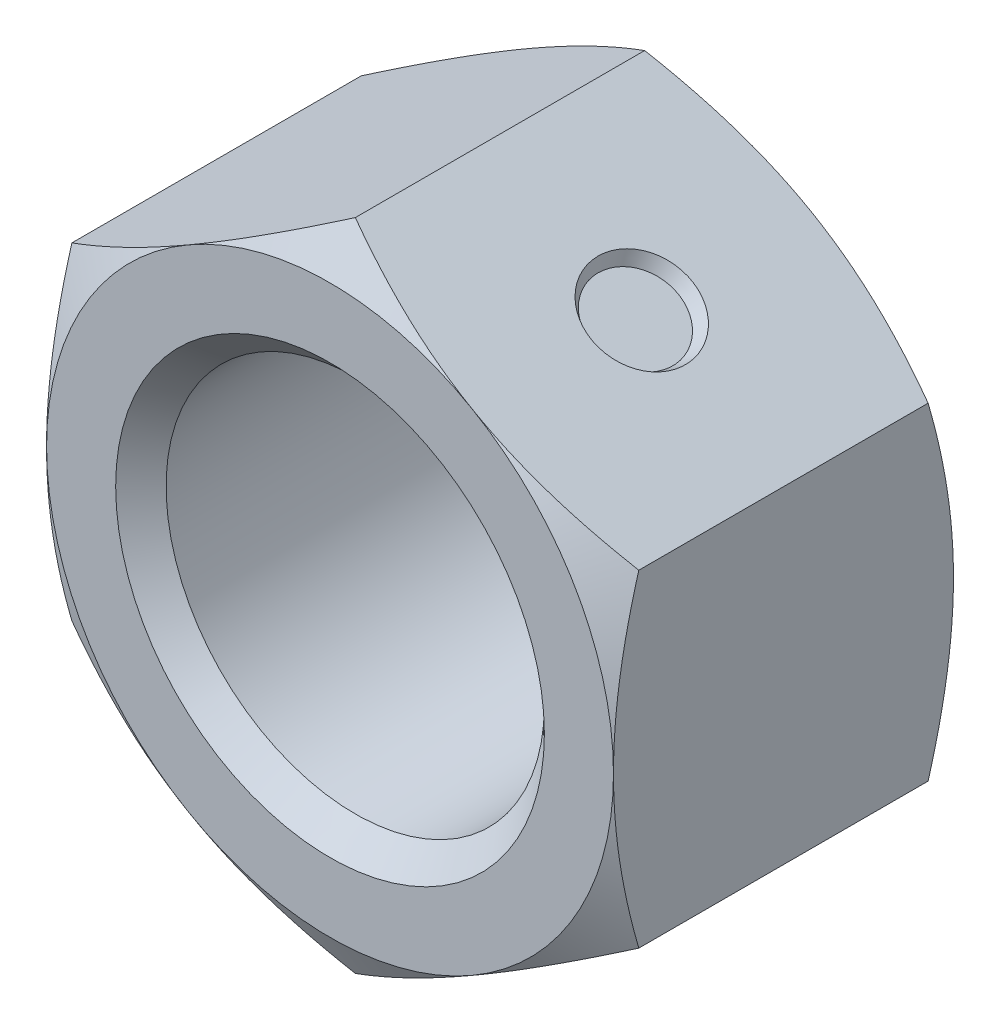
ISO-10303-21;
HEADER;
FILE_DESCRIPTION(('STEP AP214'),'2;1');
FILE_NAME('part.step','',(''),(''),'','','');
FILE_SCHEMA(('AUTOMOTIVE_DESIGN { 1 0 10303 214 1 1 1 1 }'));
ENDSEC;
DATA;
#1=APPLICATION_CONTEXT('core data for automotive mechanical design processes');
#2=APPLICATION_PROTOCOL_DEFINITION('international standard','automotive_design',2000,#1);
#3=PRODUCT_CONTEXT('',#1,'mechanical');
#4=PRODUCT('Part','Part','',(#3));
#5=PRODUCT_RELATED_PRODUCT_CATEGORY('part','',(#4));
#6=PRODUCT_DEFINITION_FORMATION('','',#4);
#7=PRODUCT_DEFINITION_CONTEXT('part definition',#1,'design');
#8=PRODUCT_DEFINITION('design','',#6,#7);
#9=PRODUCT_DEFINITION_SHAPE('','',#8);
#10=(LENGTH_UNIT() NAMED_UNIT(*) SI_UNIT(.MILLI.,.METRE.));
#11=(NAMED_UNIT(*) PLANE_ANGLE_UNIT() SI_UNIT($,.RADIAN.));
#12=(NAMED_UNIT(*) SI_UNIT($,.STERADIAN.) SOLID_ANGLE_UNIT());
#13=UNCERTAINTY_MEASURE_WITH_UNIT(LENGTH_MEASURE(1.E-05),#10,'distance_accuracy_value','');
#14=(GEOMETRIC_REPRESENTATION_CONTEXT(3) GLOBAL_UNCERTAINTY_ASSIGNED_CONTEXT((#13)) GLOBAL_UNIT_ASSIGNED_CONTEXT((#10,
#11,#12)) REPRESENTATION_CONTEXT('',''));
#15=CARTESIAN_POINT('',(0.,0.,0.));
#16=DIRECTION('',(0.,0.,1.));
#17=DIRECTION('',(1.,0.,0.));
#18=AXIS2_PLACEMENT_3D('',#15,#16,#17);
#19=CARTESIAN_POINT('',(32.87395,-11.6197933487305,27.2542));
#20=DIRECTION('',(0.499999999999994,0.866025403784442,0.));
#21=DIRECTION('',(0.,0.,-1.));
#22=AXIS2_PLACEMENT_3D('',#19,#20,#21);
#23=PLANE('',#22);
#24=CARTESIAN_POINT('',(32.87395,-11.6197933487305,27.2542));
#25=DIRECTION('',(0.499999999999994,0.866025403784442,0.));
#26=DIRECTION('',(-0.866025403784442,0.499999999999994,0.));
#27=AXIS2_PLACEMENT_3D('',#24,#25,#26);
#28=CIRCLE('',#27,1.08669128953229);
#29=CARTESIAN_POINT('',(31.9328477371938,-11.0764477039644,27.2542));
#30=VERTEX_POINT('',#29);
#31=EDGE_CURVE('E475',#30,#30,#28,.T.);
#32=ORIENTED_EDGE('',*,*,#31,.T.);
#33=EDGE_LOOP('',(#32));
#34=FACE_BOUND('',#33,.T.);
#35=ADVANCED_FACE('F49',(#34),#23,.T.);
#36=CARTESIAN_POINT('',(22.6441,-17.526,27.2542));
#37=DIRECTION('',(-1.,0.,0.));
#38=DIRECTION('',(0.,1.,0.));
#39=AXIS2_PLACEMENT_3D('',#36,#37,#38);
#40=PLANE('',#39);
#41=CARTESIAN_POINT('',(22.6441,-17.526,27.2542));
#42=DIRECTION('',(-1.,0.,0.));
#43=DIRECTION('',(0.,-1.,0.));
#44=AXIS2_PLACEMENT_3D('',#41,#42,#43);
#45=CIRCLE('',#44,1.08669128953229);
#46=CARTESIAN_POINT('',(22.6441,-18.6126912895323,27.2542));
#47=VERTEX_POINT('',#46);
#48=EDGE_CURVE('E457',#47,#47,#45,.T.);
#49=ORIENTED_EDGE('',*,*,#48,.T.);
#50=EDGE_LOOP('',(#49));
#51=FACE_BOUND('',#50,.T.);
#52=ADVANCED_FACE('F504',(#51),#40,.T.);
#53=CARTESIAN_POINT('',(32.87395,-23.4322066512695,27.2542));
#54=DIRECTION('',(0.5,-0.866025403784437,0.));
#55=DIRECTION('',(0.,0.,-1.));
#56=AXIS2_PLACEMENT_3D('',#53,#54,#55);
#57=PLANE('',#56);
#58=CARTESIAN_POINT('',(32.87395,-23.4322066512695,27.2542));
#59=DIRECTION('',(0.5,-0.866025403784438,0.));
#60=DIRECTION('',(0.866025403784438,0.5,0.));
#61=AXIS2_PLACEMENT_3D('',#58,#59,#60);
#62=CIRCLE('',#61,1.08669128953229);
#63=CARTESIAN_POINT('',(33.8150522628062,-22.8888610065034,27.2542));
#64=VERTEX_POINT('',#63);
#65=EDGE_CURVE('E411',#64,#64,#62,.T.);
#66=ORIENTED_EDGE('',*,*,#65,.T.);
#67=EDGE_LOOP('',(#66));
#68=FACE_BOUND('',#67,.T.);
#69=ADVANCED_FACE('F509',(#68),#57,.T.);
#70=CARTESIAN_POINT('',(29.464,-17.526,22.9743));
#71=DIRECTION('',(0.,0.,1.));
#72=DIRECTION('',(-1.,0.,0.));
#73=AXIS2_PLACEMENT_3D('',#70,#71,#72);
#74=CONICAL_SURFACE('',#73,7.1374,1.0471975511966);
#75=CARTESIAN_POINT('',(33.0327,-11.344830283029,22.9743));
#76=CARTESIAN_POINT('',(34.6889394339755,-12.3010605660771,22.9743));
#77=CARTESIAN_POINT('',(36.6014000000828,-13.4052201887338,23.6117868553802));
#78=(BOUNDED_CURVE() B_SPLINE_CURVE(2,(#75,#76,#77),.UNSPECIFIED.,.F.,
.F.) B_SPLINE_CURVE_WITH_KNOTS((3,3),(2.45341005378475,3.35047683898972),
.UNSPECIFIED.) CURVE() GEOMETRIC_REPRESENTATION_ITEM() RATIONAL_B_SPLINE_CURVE((2.15995035378409,
2.15995035378409,2.00487289561089)) REPRESENTATION_ITEM(''));
#79=CARTESIAN_POINT('',(33.0327,-11.3448302830289,22.9743));
#80=VERTEX_POINT('',#79);
#81=CARTESIAN_POINT('',(36.6014,-13.405220188686,23.6117868553526));
#82=VERTEX_POINT('',#81);
#83=EDGE_CURVE('E185',#80,#82,#78,.T.);
#84=ORIENTED_EDGE('',*,*,#83,.T.);
#85=CARTESIAN_POINT('',(36.6014,-13.4052201887554,23.6117868553326));
#86=CARTESIAN_POINT('',(36.6014,-15.61353943397,22.9743));
#87=CARTESIAN_POINT('',(36.6014,-17.526,22.9743));
#88=(BOUNDED_CURVE() B_SPLINE_CURVE(2,(#85,#86,#87),.UNSPECIFIED.,.F.,
.F.) B_SPLINE_CURVE_WITH_KNOTS((3,3),(1.55634326861089,2.45341005378474),
.UNSPECIFIED.) CURVE() GEOMETRIC_REPRESENTATION_ITEM() RATIONAL_B_SPLINE_CURVE((2.00487289562164,
2.15995035378408,2.15995035378408)) REPRESENTATION_ITEM(''));
#89=CARTESIAN_POINT('',(36.6014,-17.526,22.9743));
#90=VERTEX_POINT('',#89);
#91=EDGE_CURVE('E169',#82,#90,#88,.T.);
#92=ORIENTED_EDGE('',*,*,#91,.T.);
#93=CARTESIAN_POINT('',(29.464,-17.526,22.9743));
#94=DIRECTION('',(0.,0.,1.));
#95=DIRECTION('',(1.,0.,0.));
#96=AXIS2_PLACEMENT_3D('',#93,#94,#95);
#97=CIRCLE('',#96,7.1374);
#98=EDGE_CURVE('E187',#90,#80,#97,.T.);
#99=ORIENTED_EDGE('',*,*,#98,.T.);
#100=EDGE_LOOP('',(#84,#92,#99));
#101=FACE_BOUND('',#100,.T.);
#102=ADVANCED_FACE('F186',(#101),#74,.T.);
#103=CARTESIAN_POINT('',(29.464,-17.526,22.9743));
#104=DIRECTION('',(0.,0.,1.));
#105=DIRECTION('',(-1.,0.,0.));
#106=AXIS2_PLACEMENT_3D('',#103,#104,#105);
#107=CONICAL_SURFACE('',#106,7.1374,1.0471975511966);
#108=CARTESIAN_POINT('',(25.8953,-11.344830283029,22.9743));
#109=CARTESIAN_POINT('',(27.5515394339753,-10.3885999999808,22.9743));
#110=CARTESIAN_POINT('',(29.4640000000828,-9.28444037732413,23.6117868553802));
#111=(BOUNDED_CURVE() B_SPLINE_CURVE(2,(#108,#109,#110),.UNSPECIFIED.,.F.,
.F.) B_SPLINE_CURVE_WITH_KNOTS((3,3),(2.45341005378474,3.35047683898972),
.UNSPECIFIED.) CURVE() GEOMETRIC_REPRESENTATION_ITEM() RATIONAL_B_SPLINE_CURVE((2.15995035378409,
2.15995035378409,2.00487289561089)) REPRESENTATION_ITEM(''));
#112=CARTESIAN_POINT('',(25.8953,-11.3448302830289,22.9743));
#113=VERTEX_POINT('',#112);
#114=CARTESIAN_POINT('',(29.464,-9.28444037737192,23.6117868553526));
#115=VERTEX_POINT('',#114);
#116=EDGE_CURVE('E229',#113,#115,#111,.T.);
#117=ORIENTED_EDGE('',*,*,#116,.T.);
#118=CARTESIAN_POINT('',(29.4640000000602,-9.28444037740666,23.6117868553326));
#119=CARTESIAN_POINT('',(31.3764605660822,-10.3886000000139,22.9743));
#120=CARTESIAN_POINT('',(33.0327,-11.3448302830289,22.9743));
#121=(BOUNDED_CURVE() B_SPLINE_CURVE(2,(#118,#119,#120),.UNSPECIFIED.,.F.,
.F.) B_SPLINE_CURVE_WITH_KNOTS((3,3),(1.55634326861089,2.45341005378474),
.UNSPECIFIED.) CURVE() GEOMETRIC_REPRESENTATION_ITEM() RATIONAL_B_SPLINE_CURVE((2.00487289562165,
2.15995035378409,2.15995035378409)) REPRESENTATION_ITEM(''));
#122=EDGE_CURVE('E426',#115,#80,#121,.T.);
#123=ORIENTED_EDGE('',*,*,#122,.T.);
#124=CARTESIAN_POINT('',(29.464,-17.526,22.9743));
#125=DIRECTION('',(0.,0.,1.));
#126=DIRECTION('',(1.,0.,0.));
#127=AXIS2_PLACEMENT_3D('',#124,#125,#126);
#128=CIRCLE('',#127,7.1374);
#129=EDGE_CURVE('E312',#80,#113,#128,.T.);
#130=ORIENTED_EDGE('',*,*,#129,.T.);
#131=EDGE_LOOP('',(#117,#123,#130));
#132=FACE_BOUND('',#131,.T.);
#133=ADVANCED_FACE('F520',(#132),#107,.T.);
#134=CARTESIAN_POINT('',(29.464,-17.526,22.9743));
#135=DIRECTION('',(0.,0.,1.));
#136=DIRECTION('',(-1.,0.,0.));
#137=AXIS2_PLACEMENT_3D('',#134,#135,#136);
#138=CONICAL_SURFACE('',#137,7.1374,1.0471975511966);
#139=CARTESIAN_POINT('',(22.3266,-17.526,22.9743));
#140=CARTESIAN_POINT('',(22.3266,-15.6135394339037,22.9743));
#141=CARTESIAN_POINT('',(22.3266,-13.4052201885903,23.6117868553802));
#142=(BOUNDED_CURVE() B_SPLINE_CURVE(2,(#139,#140,#141),.UNSPECIFIED.,.F.,
.F.) B_SPLINE_CURVE_WITH_KNOTS((3,3),(2.45341005378474,3.35047683898973),
.UNSPECIFIED.) CURVE() GEOMETRIC_REPRESENTATION_ITEM() RATIONAL_B_SPLINE_CURVE((2.1599503537841,
2.1599503537841,2.00487289561089)) REPRESENTATION_ITEM(''));
#143=CARTESIAN_POINT('',(22.3266,-17.526,22.9743));
#144=VERTEX_POINT('',#143);
#145=CARTESIAN_POINT('',(22.3266,-13.405220188686,23.6117868553526));
#146=VERTEX_POINT('',#145);
#147=EDGE_CURVE('E265',#144,#146,#142,.T.);
#148=ORIENTED_EDGE('',*,*,#147,.T.);
#149=CARTESIAN_POINT('',(22.3266000000601,-13.4052201886512,23.6117868553326));
#150=CARTESIAN_POINT('',(24.2390605660821,-12.301060566044,22.9743));
#151=CARTESIAN_POINT('',(25.8953,-11.344830283029,22.9743));
#152=(BOUNDED_CURVE() B_SPLINE_CURVE(2,(#149,#150,#151),.UNSPECIFIED.,.F.,
.F.) B_SPLINE_CURVE_WITH_KNOTS((3,3),(1.55634326861089,2.45341005378475),
.UNSPECIFIED.) CURVE() GEOMETRIC_REPRESENTATION_ITEM() RATIONAL_B_SPLINE_CURVE((2.00487289562165,
2.15995035378409,2.15995035378409)) REPRESENTATION_ITEM(''));
#153=EDGE_CURVE('E192',#146,#113,#152,.T.);
#154=ORIENTED_EDGE('',*,*,#153,.T.);
#155=CARTESIAN_POINT('',(29.464,-17.526,22.9743));
#156=DIRECTION('',(0.,0.,-1.));
#157=DIRECTION('',(-1.,0.,0.));
#158=AXIS2_PLACEMENT_3D('',#155,#156,#157);
#159=CIRCLE('',#158,7.1374);
#160=EDGE_CURVE('E305',#144,#113,#159,.T.);
#161=ORIENTED_EDGE('',*,*,#160,.F.);
#162=EDGE_LOOP('',(#148,#154,#161));
#163=FACE_BOUND('',#162,.T.);
#164=ADVANCED_FACE('F523',(#163),#138,.T.);
#165=CARTESIAN_POINT('',(29.464,-17.526,22.9743));
#166=DIRECTION('',(0.,0.,1.));
#167=DIRECTION('',(-1.,0.,0.));
#168=AXIS2_PLACEMENT_3D('',#165,#166,#167);
#169=CONICAL_SURFACE('',#168,7.1374,1.0471975511966);
#170=CARTESIAN_POINT('',(22.3266,-21.6467798112446,23.6117868553326));
#171=CARTESIAN_POINT('',(22.3266,-19.43846056603,22.9743));
#172=CARTESIAN_POINT('',(22.3266,-17.526,22.9743));
#173=(BOUNDED_CURVE() B_SPLINE_CURVE(2,(#170,#171,#172),.UNSPECIFIED.,.F.,
.F.) B_SPLINE_CURVE_WITH_KNOTS((3,3),(1.55634326861089,2.45341005378474),
.UNSPECIFIED.) CURVE() GEOMETRIC_REPRESENTATION_ITEM() RATIONAL_B_SPLINE_CURVE((2.00487289562165,
2.1599503537841,2.1599503537841)) REPRESENTATION_ITEM(''));
#174=CARTESIAN_POINT('',(22.3266,-21.6467798113141,23.6117868553526));
#175=VERTEX_POINT('',#174);
#176=EDGE_CURVE('E237',#175,#144,#173,.T.);
#177=ORIENTED_EDGE('',*,*,#176,.T.);
#178=CARTESIAN_POINT('',(29.464,-17.526,22.9743));
#179=DIRECTION('',(0.,0.,1.));
#180=DIRECTION('',(1.,0.,0.));
#181=AXIS2_PLACEMENT_3D('',#178,#179,#180);
#182=CIRCLE('',#181,7.1374);
#183=CARTESIAN_POINT('',(25.8953,-23.7071697169711,22.9743));
#184=VERTEX_POINT('',#183);
#185=EDGE_CURVE('E313',#144,#184,#182,.T.);
#186=ORIENTED_EDGE('',*,*,#185,.T.);
#187=CARTESIAN_POINT('',(25.8953,-23.707169716971,22.9743));
#188=CARTESIAN_POINT('',(24.2390605660246,-22.7509394339229,22.9743));
#189=CARTESIAN_POINT('',(22.3265999999171,-21.6467798112662,23.6117868553802));
#190=(BOUNDED_CURVE() B_SPLINE_CURVE(2,(#187,#188,#189),.UNSPECIFIED.,.F.,
.F.) B_SPLINE_CURVE_WITH_KNOTS((3,3),(2.45341005378475,3.35047683898973),
.UNSPECIFIED.) CURVE() GEOMETRIC_REPRESENTATION_ITEM() RATIONAL_B_SPLINE_CURVE((2.15995035378408,
2.15995035378408,2.00487289561088)) REPRESENTATION_ITEM(''));
#191=EDGE_CURVE('E296',#184,#175,#190,.T.);
#192=ORIENTED_EDGE('',*,*,#191,.T.);
#193=EDGE_LOOP('',(#177,#186,#192));
#194=FACE_BOUND('',#193,.T.);
#195=ADVANCED_FACE('F527',(#194),#169,.T.);
#196=CARTESIAN_POINT('',(29.464,-17.526,22.9743));
#197=DIRECTION('',(0.,0.,1.));
#198=DIRECTION('',(-1.,0.,0.));
#199=AXIS2_PLACEMENT_3D('',#196,#197,#198);
#200=CONICAL_SURFACE('',#199,7.1374,1.0471975511966);
#201=CARTESIAN_POINT('',(29.4639999999398,-25.7675596225933,23.6117868553326));
#202=CARTESIAN_POINT('',(27.5515394339179,-24.6633999999861,22.9743));
#203=CARTESIAN_POINT('',(25.8953,-23.7071697169711,22.9743));
#204=(BOUNDED_CURVE() B_SPLINE_CURVE(2,(#201,#202,#203),.UNSPECIFIED.,.F.,
.F.) B_SPLINE_CURVE_WITH_KNOTS((3,3),(1.55634326861089,2.45341005378474),
.UNSPECIFIED.) CURVE() GEOMETRIC_REPRESENTATION_ITEM() RATIONAL_B_SPLINE_CURVE((2.00487289562164,
2.15995035378408,2.15995035378408)) REPRESENTATION_ITEM(''));
#205=CARTESIAN_POINT('',(29.464,-25.7675596226281,23.6117868553526));
#206=VERTEX_POINT('',#205);
#207=EDGE_CURVE('E273',#206,#184,#204,.T.);
#208=ORIENTED_EDGE('',*,*,#207,.T.);
#209=CARTESIAN_POINT('',(29.464,-17.526,22.9743));
#210=DIRECTION('',(0.,0.,1.));
#211=DIRECTION('',(1.,0.,0.));
#212=AXIS2_PLACEMENT_3D('',#209,#210,#211);
#213=CIRCLE('',#212,7.1374);
#214=CARTESIAN_POINT('',(33.0327,-23.7071697169711,22.9743));
#215=VERTEX_POINT('',#214);
#216=EDGE_CURVE('E209',#184,#215,#213,.T.);
#217=ORIENTED_EDGE('',*,*,#216,.T.);
#218=CARTESIAN_POINT('',(33.0327,-23.707169716971,22.9743));
#219=CARTESIAN_POINT('',(31.3764605660248,-24.6634000000192,22.9743));
#220=CARTESIAN_POINT('',(29.4639999999172,-25.7675596226758,23.6117868553802));
#221=(BOUNDED_CURVE() B_SPLINE_CURVE(2,(#218,#219,#220),.UNSPECIFIED.,.F.,
.F.) B_SPLINE_CURVE_WITH_KNOTS((3,3),(2.45341005378474,3.35047683898972),
.UNSPECIFIED.) CURVE() GEOMETRIC_REPRESENTATION_ITEM() RATIONAL_B_SPLINE_CURVE((2.15995035378408,
2.15995035378408,2.00487289561088)) REPRESENTATION_ITEM(''));
#222=EDGE_CURVE('E182',#215,#206,#221,.T.);
#223=ORIENTED_EDGE('',*,*,#222,.T.);
#224=EDGE_LOOP('',(#208,#217,#223));
#225=FACE_BOUND('',#224,.T.);
#226=ADVANCED_FACE('F531',(#225),#200,.T.);
#227=CARTESIAN_POINT('',(29.464,-17.526,22.9743));
#228=DIRECTION('',(0.,0.,1.));
#229=DIRECTION('',(-1.,0.,0.));
#230=AXIS2_PLACEMENT_3D('',#227,#228,#229);
#231=CONICAL_SURFACE('',#230,7.1374,1.0471975511966);
#232=CARTESIAN_POINT('',(36.6013999999398,-21.6467798113488,23.6117868553326));
#233=CARTESIAN_POINT('',(34.6889394339179,-22.7509394339561,22.9743));
#234=CARTESIAN_POINT('',(33.0327,-23.7071697169711,22.9743));
#235=(BOUNDED_CURVE() B_SPLINE_CURVE(2,(#232,#233,#234),.UNSPECIFIED.,.F.,
.F.) B_SPLINE_CURVE_WITH_KNOTS((3,3),(1.55634326861089,2.45341005378475),
.UNSPECIFIED.) CURVE() GEOMETRIC_REPRESENTATION_ITEM() RATIONAL_B_SPLINE_CURVE((2.00487289562164,
2.15995035378409,2.15995035378408)) REPRESENTATION_ITEM(''));
#236=CARTESIAN_POINT('',(36.6014,-21.6467798113141,23.6117868553526));
#237=VERTEX_POINT('',#236);
#238=EDGE_CURVE('E304',#237,#215,#235,.T.);
#239=ORIENTED_EDGE('',*,*,#238,.T.);
#240=CARTESIAN_POINT('',(29.464,-17.526,22.9743));
#241=DIRECTION('',(0.,0.,1.));
#242=DIRECTION('',(1.,0.,0.));
#243=AXIS2_PLACEMENT_3D('',#240,#241,#242);
#244=CIRCLE('',#243,7.1374);
#245=EDGE_CURVE('E78',#215,#90,#244,.T.);
#246=ORIENTED_EDGE('',*,*,#245,.T.);
#247=CARTESIAN_POINT('',(36.6014,-17.526,22.9743));
#248=CARTESIAN_POINT('',(36.6014,-19.4384605660964,22.9743));
#249=CARTESIAN_POINT('',(36.6014,-21.6467798114097,23.6117868553802));
#250=(BOUNDED_CURVE() B_SPLINE_CURVE(2,(#247,#248,#249),.UNSPECIFIED.,.F.,
.F.) B_SPLINE_CURVE_WITH_KNOTS((3,3),(2.45341005378474,3.35047683898973),
.UNSPECIFIED.) CURVE() GEOMETRIC_REPRESENTATION_ITEM() RATIONAL_B_SPLINE_CURVE((2.15995035378408,
2.15995035378408,2.00487289561088)) REPRESENTATION_ITEM(''));
#251=EDGE_CURVE('E177',#90,#237,#250,.T.);
#252=ORIENTED_EDGE('',*,*,#251,.T.);
#253=EDGE_LOOP('',(#239,#246,#252));
#254=FACE_BOUND('',#253,.T.);
#255=ADVANCED_FACE('F535',(#254),#231,.T.);
#256=CARTESIAN_POINT('',(29.464,-17.526,31.5341));
#257=DIRECTION('',(0.,0.,-1.));
#258=DIRECTION('',(1.,0.,0.));
#259=AXIS2_PLACEMENT_3D('',#256,#257,#258);
#260=CONICAL_SURFACE('',#259,7.1374,1.0471975511966);
#261=CARTESIAN_POINT('',(33.0327,-11.344830283029,31.5341));
#262=CARTESIAN_POINT('',(31.3764605660245,-10.3885999999808,31.5341));
#263=CARTESIAN_POINT('',(29.4639999999172,-9.28444037732413,30.8966131446197));
#264=(BOUNDED_CURVE() B_SPLINE_CURVE(2,(#261,#262,#263),.UNSPECIFIED.,.F.,
.F.) B_SPLINE_CURVE_WITH_KNOTS((3,3),(2.45341005378474,3.35047683898972),
.UNSPECIFIED.) CURVE() GEOMETRIC_REPRESENTATION_ITEM() RATIONAL_B_SPLINE_CURVE((2.15995035378409,
2.15995035378409,2.00487289561089)) REPRESENTATION_ITEM(''));
#265=CARTESIAN_POINT('',(33.0327,-11.344830283029,31.5341));
#266=VERTEX_POINT('',#265);
#267=CARTESIAN_POINT('',(29.464,-9.28444037737192,30.8966131446474));
#268=VERTEX_POINT('',#267);
#269=EDGE_CURVE('E202',#266,#268,#264,.T.);
#270=ORIENTED_EDGE('',*,*,#269,.T.);
#271=CARTESIAN_POINT('',(29.4639999999398,-9.28444037740663,30.8966131446674));
#272=CARTESIAN_POINT('',(27.5515394339179,-10.388600000014,31.5341));
#273=CARTESIAN_POINT('',(25.8953,-11.344830283029,31.5341));
#274=(BOUNDED_CURVE() B_SPLINE_CURVE(2,(#271,#272,#273),.UNSPECIFIED.,.F.,
.F.) B_SPLINE_CURVE_WITH_KNOTS((3,3),(1.55634326861089,2.45341005378474),
.UNSPECIFIED.) CURVE() GEOMETRIC_REPRESENTATION_ITEM() RATIONAL_B_SPLINE_CURVE((2.00487289562165,
2.15995035378409,2.15995035378409)) REPRESENTATION_ITEM(''));
#275=CARTESIAN_POINT('',(25.8953,-11.344830283029,31.5341));
#276=VERTEX_POINT('',#275);
#277=EDGE_CURVE('E228',#268,#276,#274,.T.);
#278=ORIENTED_EDGE('',*,*,#277,.T.);
#279=CARTESIAN_POINT('',(29.464,-17.526,31.5341));
#280=DIRECTION('',(0.,0.,1.));
#281=DIRECTION('',(1.,0.,0.));
#282=AXIS2_PLACEMENT_3D('',#279,#280,#281);
#283=CIRCLE('',#282,7.1374);
#284=EDGE_CURVE('E390',#266,#276,#283,.T.);
#285=ORIENTED_EDGE('',*,*,#284,.F.);
#286=EDGE_LOOP('',(#270,#278,#285));
#287=FACE_BOUND('',#286,.T.);
#288=ADVANCED_FACE('F539',(#287),#260,.T.);
#289=CARTESIAN_POINT('',(29.464,-17.526,31.5341));
#290=DIRECTION('',(0.,0.,-1.));
#291=DIRECTION('',(1.,0.,0.));
#292=AXIS2_PLACEMENT_3D('',#289,#290,#291);
#293=CONICAL_SURFACE('',#292,7.1374,1.0471975511966);
#294=CARTESIAN_POINT('',(25.8953,-11.344830283029,31.5341));
#295=CARTESIAN_POINT('',(24.2390605660246,-12.3010605660771,31.5341));
#296=CARTESIAN_POINT('',(22.3265999999172,-13.4052201887338,30.8966131446199));
#297=(BOUNDED_CURVE() B_SPLINE_CURVE(2,(#294,#295,#296),.UNSPECIFIED.,.F.,
.F.) B_SPLINE_CURVE_WITH_KNOTS((3,3),(2.45341005378474,3.35047683898972),
.UNSPECIFIED.) CURVE() GEOMETRIC_REPRESENTATION_ITEM() RATIONAL_B_SPLINE_CURVE((2.15995035378409,
2.15995035378409,2.00487289561089)) REPRESENTATION_ITEM(''));
#298=CARTESIAN_POINT('',(22.3266,-13.405220188686,30.8966131446474));
#299=VERTEX_POINT('',#298);
#300=EDGE_CURVE('E222',#276,#299,#297,.T.);
#301=ORIENTED_EDGE('',*,*,#300,.T.);
#302=CARTESIAN_POINT('',(22.3266,-13.4052201887554,30.8966131446674));
#303=CARTESIAN_POINT('',(22.3266,-15.6135394339701,31.5341));
#304=CARTESIAN_POINT('',(22.3266,-17.526,31.5341));
#305=(BOUNDED_CURVE() B_SPLINE_CURVE(2,(#302,#303,#304),.UNSPECIFIED.,.F.,
.F.) B_SPLINE_CURVE_WITH_KNOTS((3,3),(1.55634326861089,2.45341005378475),
.UNSPECIFIED.) CURVE() GEOMETRIC_REPRESENTATION_ITEM() RATIONAL_B_SPLINE_CURVE((2.00487289562164,
2.15995035378409,2.15995035378409)) REPRESENTATION_ITEM(''));
#306=CARTESIAN_POINT('',(22.3266,-17.526,31.5341));
#307=VERTEX_POINT('',#306);
#308=EDGE_CURVE('E256',#299,#307,#305,.T.);
#309=ORIENTED_EDGE('',*,*,#308,.T.);
#310=CARTESIAN_POINT('',(29.464,-17.526,31.5341));
#311=DIRECTION('',(0.,0.,1.));
#312=DIRECTION('',(1.,0.,0.));
#313=AXIS2_PLACEMENT_3D('',#310,#311,#312);
#314=CIRCLE('',#313,7.1374);
#315=EDGE_CURVE('E393',#276,#307,#314,.T.);
#316=ORIENTED_EDGE('',*,*,#315,.F.);
#317=EDGE_LOOP('',(#301,#309,#316));
#318=FACE_BOUND('',#317,.T.);
#319=ADVANCED_FACE('F542',(#318),#293,.T.);
#320=CARTESIAN_POINT('',(29.464,-17.526,31.5341));
#321=DIRECTION('',(0.,0.,-1.));
#322=DIRECTION('',(1.,0.,0.));
#323=AXIS2_PLACEMENT_3D('',#320,#321,#322);
#324=CONICAL_SURFACE('',#323,7.1374,1.0471975511966);
#325=CARTESIAN_POINT('',(22.3266,-17.526,31.5341));
#326=CARTESIAN_POINT('',(22.3266,-19.4384605660964,31.5341));
#327=CARTESIAN_POINT('',(22.3266,-21.6467798114097,30.8966131446197));
#328=(BOUNDED_CURVE() B_SPLINE_CURVE(2,(#325,#326,#327),.UNSPECIFIED.,.F.,
.F.) B_SPLINE_CURVE_WITH_KNOTS((3,3),(2.45341005378475,3.35047683898973),
.UNSPECIFIED.) CURVE() GEOMETRIC_REPRESENTATION_ITEM() RATIONAL_B_SPLINE_CURVE((2.15995035378409,
2.15995035378408,2.00487289561088)) REPRESENTATION_ITEM(''));
#329=CARTESIAN_POINT('',(22.3266,-21.6467798113141,30.8966131446474));
#330=VERTEX_POINT('',#329);
#331=EDGE_CURVE('E247',#307,#330,#328,.T.);
#332=ORIENTED_EDGE('',*,*,#331,.T.);
#333=CARTESIAN_POINT('',(22.3266000000602,-21.6467798113488,30.8966131446674));
#334=CARTESIAN_POINT('',(24.239060566082,-22.7509394339561,31.5341));
#335=CARTESIAN_POINT('',(25.8953,-23.7071697169711,31.5341));
#336=(BOUNDED_CURVE() B_SPLINE_CURVE(2,(#333,#334,#335),.UNSPECIFIED.,.F.,
.F.) B_SPLINE_CURVE_WITH_KNOTS((3,3),(1.55634326861089,2.45341005378474),
.UNSPECIFIED.) CURVE() GEOMETRIC_REPRESENTATION_ITEM() RATIONAL_B_SPLINE_CURVE((2.00487289562165,
2.15995035378409,2.15995035378409)) REPRESENTATION_ITEM(''));
#337=CARTESIAN_POINT('',(25.8953,-23.7071697169711,31.5341));
#338=VERTEX_POINT('',#337);
#339=EDGE_CURVE('E290',#330,#338,#336,.T.);
#340=ORIENTED_EDGE('',*,*,#339,.T.);
#341=CARTESIAN_POINT('',(29.464,-17.526,31.5341));
#342=DIRECTION('',(0.,0.,1.));
#343=DIRECTION('',(1.,0.,0.));
#344=AXIS2_PLACEMENT_3D('',#341,#342,#343);
#345=CIRCLE('',#344,7.1374);
#346=EDGE_CURVE('E57',#307,#338,#345,.T.);
#347=ORIENTED_EDGE('',*,*,#346,.F.);
#348=EDGE_LOOP('',(#332,#340,#347));
#349=FACE_BOUND('',#348,.T.);
#350=ADVANCED_FACE('F547',(#349),#324,.T.);
#351=CARTESIAN_POINT('',(29.464,-17.526,31.5341));
#352=DIRECTION('',(0.,0.,-1.));
#353=DIRECTION('',(1.,0.,0.));
#354=AXIS2_PLACEMENT_3D('',#351,#352,#353);
#355=CONICAL_SURFACE('',#354,7.1374,1.0471975511966);
#356=CARTESIAN_POINT('',(25.8953,-23.7071697169711,31.5341));
#357=CARTESIAN_POINT('',(27.5515394339755,-24.6634000000192,31.5341));
#358=CARTESIAN_POINT('',(29.4640000000828,-25.7675596226758,30.8966131446197));
#359=(BOUNDED_CURVE() B_SPLINE_CURVE(2,(#356,#357,#358),.UNSPECIFIED.,.F.,
.F.) B_SPLINE_CURVE_WITH_KNOTS((3,3),(2.45341005378474,3.35047683898972),
.UNSPECIFIED.) CURVE() GEOMETRIC_REPRESENTATION_ITEM() RATIONAL_B_SPLINE_CURVE((2.15995035378409,
2.15995035378409,2.00487289561089)) REPRESENTATION_ITEM(''));
#360=CARTESIAN_POINT('',(29.464,-25.7675596226281,30.8966131446474));
#361=VERTEX_POINT('',#360);
#362=EDGE_CURVE('E289',#338,#361,#359,.T.);
#363=ORIENTED_EDGE('',*,*,#362,.T.);
#364=CARTESIAN_POINT('',(29.4640000000602,-25.7675596225933,30.8966131446674));
#365=CARTESIAN_POINT('',(31.3764605660822,-24.6633999999861,31.5341));
#366=CARTESIAN_POINT('',(33.0327,-23.7071697169711,31.5341));
#367=(BOUNDED_CURVE() B_SPLINE_CURVE(2,(#364,#365,#366),.UNSPECIFIED.,.F.,
.F.) B_SPLINE_CURVE_WITH_KNOTS((3,3),(1.55634326861089,2.45341005378474),
.UNSPECIFIED.) CURVE() GEOMETRIC_REPRESENTATION_ITEM() RATIONAL_B_SPLINE_CURVE((2.00487289562165,
2.15995035378409,2.15995035378409)) REPRESENTATION_ITEM(''));
#368=CARTESIAN_POINT('',(33.0327,-23.707169716971,31.5341));
#369=VERTEX_POINT('',#368);
#370=EDGE_CURVE('E330',#361,#369,#367,.T.);
#371=ORIENTED_EDGE('',*,*,#370,.T.);
#372=CARTESIAN_POINT('',(29.464,-17.526,31.5341));
#373=DIRECTION('',(0.,0.,1.));
#374=DIRECTION('',(1.,0.,0.));
#375=AXIS2_PLACEMENT_3D('',#372,#373,#374);
#376=CIRCLE('',#375,7.1374);
#377=EDGE_CURVE('E11',#338,#369,#376,.T.);
#378=ORIENTED_EDGE('',*,*,#377,.F.);
#379=EDGE_LOOP('',(#363,#371,#378));
#380=FACE_BOUND('',#379,.T.);
#381=ADVANCED_FACE('F543',(#380),#355,.T.);
#382=CARTESIAN_POINT('',(29.464,-17.526,31.5341));
#383=DIRECTION('',(0.,0.,-1.));
#384=DIRECTION('',(1.,0.,0.));
#385=AXIS2_PLACEMENT_3D('',#382,#383,#384);
#386=CONICAL_SURFACE('',#385,7.1374,1.0471975511966);
#387=CARTESIAN_POINT('',(33.0327,-23.7071697169711,31.5341));
#388=CARTESIAN_POINT('',(34.6889394339755,-22.7509394339229,31.5341));
#389=CARTESIAN_POINT('',(36.6014000000828,-21.6467798112662,30.8966131446197));
#390=(BOUNDED_CURVE() B_SPLINE_CURVE(2,(#387,#388,#389),.UNSPECIFIED.,.F.,
.F.) B_SPLINE_CURVE_WITH_KNOTS((3,3),(2.45341005378474,3.35047683898972),
.UNSPECIFIED.) CURVE() GEOMETRIC_REPRESENTATION_ITEM() RATIONAL_B_SPLINE_CURVE((2.15995035378409,
2.15995035378409,2.00487289561088)) REPRESENTATION_ITEM(''));
#391=CARTESIAN_POINT('',(36.6014,-21.6467798113141,30.8966131446474));
#392=VERTEX_POINT('',#391);
#393=EDGE_CURVE('E324',#369,#392,#390,.T.);
#394=ORIENTED_EDGE('',*,*,#393,.T.);
#395=CARTESIAN_POINT('',(36.6014,-21.6467798112446,30.8966131446674));
#396=CARTESIAN_POINT('',(36.6014,-19.43846056603,31.5341));
#397=CARTESIAN_POINT('',(36.6014,-17.526,31.5341));
#398=(BOUNDED_CURVE() B_SPLINE_CURVE(2,(#395,#396,#397),.UNSPECIFIED.,.F.,
.F.) B_SPLINE_CURVE_WITH_KNOTS((3,3),(1.55634326861089,2.45341005378474),
.UNSPECIFIED.) CURVE() GEOMETRIC_REPRESENTATION_ITEM() RATIONAL_B_SPLINE_CURVE((2.00487289562165,
2.15995035378409,2.15995035378409)) REPRESENTATION_ITEM(''));
#399=CARTESIAN_POINT('',(36.6014,-17.526,31.5341));
#400=VERTEX_POINT('',#399);
#401=EDGE_CURVE('E360',#392,#400,#398,.T.);
#402=ORIENTED_EDGE('',*,*,#401,.T.);
#403=CARTESIAN_POINT('',(29.464,-17.526,31.5341));
#404=DIRECTION('',(0.,0.,1.));
#405=DIRECTION('',(1.,0.,0.));
#406=AXIS2_PLACEMENT_3D('',#403,#404,#405);
#407=CIRCLE('',#406,7.1374);
#408=EDGE_CURVE('E385',#369,#400,#407,.T.);
#409=ORIENTED_EDGE('',*,*,#408,.F.);
#410=EDGE_LOOP('',(#394,#402,#409));
#411=FACE_BOUND('',#410,.T.);
#412=ADVANCED_FACE('F546',(#411),#386,.T.);
#413=CARTESIAN_POINT('',(29.464,-17.526,31.5341));
#414=DIRECTION('',(0.,0.,-1.));
#415=DIRECTION('',(1.,0.,0.));
#416=AXIS2_PLACEMENT_3D('',#413,#414,#415);
#417=CONICAL_SURFACE('',#416,7.1374,1.0471975511966);
#418=CARTESIAN_POINT('',(36.6013999999398,-13.4052201886512,30.8966131446674));
#419=CARTESIAN_POINT('',(34.6889394339179,-12.301060566044,31.5341));
#420=CARTESIAN_POINT('',(33.0327,-11.344830283029,31.5341));
#421=(BOUNDED_CURVE() B_SPLINE_CURVE(2,(#418,#419,#420),.UNSPECIFIED.,.F.,
.F.) B_SPLINE_CURVE_WITH_KNOTS((3,3),(1.55634326861089,2.45341005378474),
.UNSPECIFIED.) CURVE() GEOMETRIC_REPRESENTATION_ITEM() RATIONAL_B_SPLINE_CURVE((2.00487289562165,
2.15995035378409,2.15995035378409)) REPRESENTATION_ITEM(''));
#422=CARTESIAN_POINT('',(36.6014,-13.405220188686,30.8966131446474));
#423=VERTEX_POINT('',#422);
#424=EDGE_CURVE('E196',#423,#266,#421,.T.);
#425=ORIENTED_EDGE('',*,*,#424,.T.);
#426=CARTESIAN_POINT('',(29.464,-17.526,31.5341));
#427=DIRECTION('',(0.,0.,1.));
#428=DIRECTION('',(1.,0.,0.));
#429=AXIS2_PLACEMENT_3D('',#426,#427,#428);
#430=CIRCLE('',#429,7.1374);
#431=EDGE_CURVE('E68',#400,#266,#430,.T.);
#432=ORIENTED_EDGE('',*,*,#431,.F.);
#433=CARTESIAN_POINT('',(36.6014,-17.526,31.5341));
#434=CARTESIAN_POINT('',(36.6014,-15.6135394339037,31.5341));
#435=CARTESIAN_POINT('',(36.6014,-13.4052201885903,30.8966131446199));
#436=(BOUNDED_CURVE() B_SPLINE_CURVE(2,(#433,#434,#435),.UNSPECIFIED.,.F.,
.F.) B_SPLINE_CURVE_WITH_KNOTS((3,3),(2.45341005378474,3.35047683898972),
.UNSPECIFIED.) CURVE() GEOMETRIC_REPRESENTATION_ITEM() RATIONAL_B_SPLINE_CURVE((2.15995035378409,
2.15995035378409,2.00487289561089)) REPRESENTATION_ITEM(''));
#437=EDGE_CURVE('E181',#400,#423,#436,.T.);
#438=ORIENTED_EDGE('',*,*,#437,.T.);
#439=EDGE_LOOP('',(#425,#432,#438));
#440=FACE_BOUND('',#439,.T.);
#441=ADVANCED_FACE('F551',(#440),#417,.T.);
#442=CARTESIAN_POINT('',(0.,0.,31.5341));
#443=DIRECTION('',(0.,0.,1.));
#444=DIRECTION('',(1.,0.,0.));
#445=AXIS2_PLACEMENT_3D('',#442,#443,#444);
#446=PLANE('',#445);
#447=CARTESIAN_POINT('',(29.464,-17.526,31.5341));
#448=DIRECTION('',(0.,0.,-1.));
#449=DIRECTION('',(1.,0.,0.));
#450=AXIS2_PLACEMENT_3D('',#447,#448,#449);
#451=CIRCLE('',#450,5.3975);
#452=CARTESIAN_POINT('',(34.8615,-17.526,31.5341));
#453=VERTEX_POINT('',#452);
#454=EDGE_CURVE('E421',#453,#453,#451,.T.);
#455=ORIENTED_EDGE('',*,*,#454,.T.);
#456=EDGE_LOOP('',(#455));
#457=FACE_BOUND('',#456,.T.);
#458=ORIENTED_EDGE('',*,*,#408,.T.);
#459=ORIENTED_EDGE('',*,*,#431,.T.);
#460=ORIENTED_EDGE('',*,*,#284,.T.);
#461=ORIENTED_EDGE('',*,*,#315,.T.);
#462=ORIENTED_EDGE('',*,*,#346,.T.);
#463=ORIENTED_EDGE('',*,*,#377,.T.);
#464=EDGE_LOOP('',(#458,#459,#460,#461,#462,#463));
#465=FACE_BOUND('',#464,.T.);
#466=ADVANCED_FACE('F555',(#457,#465),#446,.T.);
#467=CARTESIAN_POINT('',(0.,0.,22.9743));
#468=DIRECTION('',(0.,0.,1.));
#469=DIRECTION('',(1.,0.,0.));
#470=AXIS2_PLACEMENT_3D('',#467,#468,#469);
#471=PLANE('',#470);
#472=CARTESIAN_POINT('',(29.464,-17.526,22.9743));
#473=DIRECTION('',(0.,0.,1.));
#474=DIRECTION('',(1.,0.,0.));
#475=AXIS2_PLACEMENT_3D('',#472,#473,#474);
#476=CIRCLE('',#475,4.7625);
#477=CARTESIAN_POINT('',(34.2265,-17.526,22.9743));
#478=VERTEX_POINT('',#477);
#479=EDGE_CURVE('E422',#478,#478,#476,.T.);
#480=ORIENTED_EDGE('',*,*,#479,.T.);
#481=EDGE_LOOP('',(#480));
#482=FACE_BOUND('',#481,.T.);
#483=ORIENTED_EDGE('',*,*,#98,.F.);
#484=ORIENTED_EDGE('',*,*,#245,.F.);
#485=ORIENTED_EDGE('',*,*,#216,.F.);
#486=ORIENTED_EDGE('',*,*,#185,.F.);
#487=ORIENTED_EDGE('',*,*,#160,.T.);
#488=ORIENTED_EDGE('',*,*,#129,.F.);
#489=EDGE_LOOP('',(#483,#484,#485,#486,#487,#488));
#490=FACE_BOUND('',#489,.T.);
#491=ADVANCED_FACE('F558',(#482,#490),#471,.F.);
#492=CARTESIAN_POINT('',(36.6014,-21.6467798113141,31.5341));
#493=DIRECTION('',(-1.,0.,0.));
#494=DIRECTION('',(0.,1.,0.));
#495=AXIS2_PLACEMENT_3D('',#492,#493,#494);
#496=PLANE('',#495);
#497=ORIENTED_EDGE('',*,*,#91,.F.);
#498=DIRECTION('',(0.,0.,-1.));
#499=VECTOR('',#498,1.);
#500=CARTESIAN_POINT('',(36.6014,-13.405220188686,31.5341));
#501=LINE('',#500,#499);
#502=EDGE_CURVE('E174',#423,#82,#501,.T.);
#503=ORIENTED_EDGE('',*,*,#502,.F.);
#504=ORIENTED_EDGE('',*,*,#437,.F.);
#505=ORIENTED_EDGE('',*,*,#401,.F.);
#506=DIRECTION('',(0.,0.,-1.));
#507=VECTOR('',#506,1.);
#508=CARTESIAN_POINT('',(36.6014,-21.6467798113141,31.5341));
#509=LINE('',#508,#507);
#510=EDGE_CURVE('E318',#392,#237,#509,.T.);
#511=ORIENTED_EDGE('',*,*,#510,.T.);
#512=ORIENTED_EDGE('',*,*,#251,.F.);
#513=EDGE_LOOP('',(#497,#503,#504,#505,#511,#512));
#514=FACE_BOUND('',#513,.T.);
#515=ADVANCED_FACE('F171',(#514),#496,.F.);
#516=CARTESIAN_POINT('',(29.464,-25.7675596226281,31.5341));
#517=DIRECTION('',(-0.5,0.866025403784438,0.));
#518=DIRECTION('',(0.,0.,1.));
#519=AXIS2_PLACEMENT_3D('',#516,#517,#518);
#520=PLANE('',#519);
#521=CARTESIAN_POINT('',(33.0327,-23.707169716971,27.2542));
#522=DIRECTION('',(0.5,-0.866025403784437,0.));
#523=DIRECTION('',(0.866025403784437,0.5,0.));
#524=AXIS2_PLACEMENT_3D('',#521,#522,#523);
#525=CIRCLE('',#524,1.27);
#526=CARTESIAN_POINT('',(34.1325522628062,-23.0721697169711,27.2542));
#527=VERTEX_POINT('',#526);
#528=EDGE_CURVE('E408',#527,#527,#525,.T.);
#529=ORIENTED_EDGE('',*,*,#528,.F.);
#530=EDGE_LOOP('',(#529));
#531=FACE_BOUND('',#530,.T.);
#532=ORIENTED_EDGE('',*,*,#238,.F.);
#533=ORIENTED_EDGE('',*,*,#510,.F.);
#534=ORIENTED_EDGE('',*,*,#393,.F.);
#535=ORIENTED_EDGE('',*,*,#370,.F.);
#536=DIRECTION('',(0.,0.,-1.));
#537=VECTOR('',#536,1.);
#538=CARTESIAN_POINT('',(29.464,-25.7675596226281,31.5341));
#539=LINE('',#538,#537);
#540=EDGE_CURVE('E282',#361,#206,#539,.T.);
#541=ORIENTED_EDGE('',*,*,#540,.T.);
#542=ORIENTED_EDGE('',*,*,#222,.F.);
#543=EDGE_LOOP('',(#532,#533,#534,#535,#541,#542));
#544=FACE_BOUND('',#543,.T.);
#545=ADVANCED_FACE('F560',(#531,#544),#520,.F.);
#546=CARTESIAN_POINT('',(22.3266,-21.6467798113141,31.5341));
#547=DIRECTION('',(0.5,0.866025403784439,0.));
#548=DIRECTION('',(0.,0.,-1.));
#549=AXIS2_PLACEMENT_3D('',#546,#547,#548);
#550=PLANE('',#549);
#551=ORIENTED_EDGE('',*,*,#207,.F.);
#552=ORIENTED_EDGE('',*,*,#540,.F.);
#553=ORIENTED_EDGE('',*,*,#362,.F.);
#554=ORIENTED_EDGE('',*,*,#339,.F.);
#555=DIRECTION('',(0.,0.,-1.));
#556=VECTOR('',#555,1.);
#557=CARTESIAN_POINT('',(22.3266,-21.6467798113141,31.5341));
#558=LINE('',#557,#556);
#559=EDGE_CURVE('E246',#330,#175,#558,.T.);
#560=ORIENTED_EDGE('',*,*,#559,.T.);
#561=ORIENTED_EDGE('',*,*,#191,.F.);
#562=EDGE_LOOP('',(#551,#552,#553,#554,#560,#561));
#563=FACE_BOUND('',#562,.T.);
#564=ADVANCED_FACE('F563',(#563),#550,.F.);
#565=CARTESIAN_POINT('',(22.3266,-13.405220188686,31.5341));
#566=DIRECTION('',(1.,0.,0.));
#567=DIRECTION('',(0.,1.,0.));
#568=AXIS2_PLACEMENT_3D('',#565,#566,#567);
#569=PLANE('',#568);
#570=CARTESIAN_POINT('',(22.3266,-17.526,27.2542));
#571=DIRECTION('',(-1.,0.,0.));
#572=DIRECTION('',(0.,-1.,0.));
#573=AXIS2_PLACEMENT_3D('',#570,#571,#572);
#574=CIRCLE('',#573,1.27);
#575=CARTESIAN_POINT('',(22.3266,-18.796,27.2542));
#576=VERTEX_POINT('',#575);
#577=EDGE_CURVE('E406',#576,#576,#574,.T.);
#578=ORIENTED_EDGE('',*,*,#577,.F.);
#579=EDGE_LOOP('',(#578));
#580=FACE_BOUND('',#579,.T.);
#581=ORIENTED_EDGE('',*,*,#176,.F.);
#582=ORIENTED_EDGE('',*,*,#559,.F.);
#583=ORIENTED_EDGE('',*,*,#331,.F.);
#584=ORIENTED_EDGE('',*,*,#308,.F.);
#585=DIRECTION('',(0.,0.,-1.));
#586=VECTOR('',#585,1.);
#587=CARTESIAN_POINT('',(22.3266,-13.405220188686,31.5341));
#588=LINE('',#587,#586);
#589=EDGE_CURVE('E215',#299,#146,#588,.T.);
#590=ORIENTED_EDGE('',*,*,#589,.T.);
#591=ORIENTED_EDGE('',*,*,#147,.F.);
#592=EDGE_LOOP('',(#581,#582,#583,#584,#590,#591));
#593=FACE_BOUND('',#592,.T.);
#594=ADVANCED_FACE('F567',(#580,#593),#569,.F.);
#595=CARTESIAN_POINT('',(29.464,-9.28444037737192,31.5341));
#596=DIRECTION('',(0.5,-0.866025403784438,0.));
#597=DIRECTION('',(0.,0.,-1.));
#598=AXIS2_PLACEMENT_3D('',#595,#596,#597);
#599=PLANE('',#598);
#600=ORIENTED_EDGE('',*,*,#153,.F.);
#601=ORIENTED_EDGE('',*,*,#589,.F.);
#602=ORIENTED_EDGE('',*,*,#300,.F.);
#603=ORIENTED_EDGE('',*,*,#277,.F.);
#604=DIRECTION('',(0.,0.,-1.));
#605=VECTOR('',#604,1.);
#606=CARTESIAN_POINT('',(29.464,-9.28444037737192,31.5341));
#607=LINE('',#606,#605);
#608=EDGE_CURVE('E433',#268,#115,#607,.T.);
#609=ORIENTED_EDGE('',*,*,#608,.T.);
#610=ORIENTED_EDGE('',*,*,#116,.F.);
#611=EDGE_LOOP('',(#600,#601,#602,#603,#609,#610));
#612=FACE_BOUND('',#611,.T.);
#613=ADVANCED_FACE('F569',(#612),#599,.F.);
#614=CARTESIAN_POINT('',(36.6014,-13.405220188686,31.5341));
#615=DIRECTION('',(-0.5,-0.866025403784439,0.));
#616=DIRECTION('',(-0.866025403784439,0.5,0.));
#617=AXIS2_PLACEMENT_3D('',#614,#615,#616);
#618=PLANE('',#617);
#619=CARTESIAN_POINT('',(33.0327,-11.3448302830289,27.2542));
#620=DIRECTION('',(0.499999999999994,0.866025403784442,0.));
#621=DIRECTION('',(-0.866025403784442,0.499999999999994,0.));
#622=AXIS2_PLACEMENT_3D('',#619,#620,#621);
#623=CIRCLE('',#622,1.27);
#624=CARTESIAN_POINT('',(31.9328477371938,-10.7098302830289,27.2542));
#625=VERTEX_POINT('',#624);
#626=EDGE_CURVE('E461',#625,#625,#623,.T.);
#627=ORIENTED_EDGE('',*,*,#626,.F.);
#628=EDGE_LOOP('',(#627));
#629=FACE_BOUND('',#628,.T.);
#630=ORIENTED_EDGE('',*,*,#122,.F.);
#631=ORIENTED_EDGE('',*,*,#608,.F.);
#632=ORIENTED_EDGE('',*,*,#269,.F.);
#633=ORIENTED_EDGE('',*,*,#424,.F.);
#634=ORIENTED_EDGE('',*,*,#502,.T.);
#635=ORIENTED_EDGE('',*,*,#83,.F.);
#636=EDGE_LOOP('',(#630,#631,#632,#633,#634,#635));
#637=FACE_BOUND('',#636,.T.);
#638=ADVANCED_FACE('F194',(#629,#637),#618,.F.);
#639=CARTESIAN_POINT('',(29.464,-17.526,31.5341));
#640=DIRECTION('',(0.,0.,-1.));
#641=DIRECTION('',(-1.,0.,0.));
#642=AXIS2_PLACEMENT_3D('',#639,#640,#641);
#643=CYLINDRICAL_SURFACE('',#642,4.7625);
#644=ORIENTED_EDGE('',*,*,#479,.F.);
#645=EDGE_LOOP('',(#644));
#646=FACE_BOUND('',#645,.T.);
#647=CARTESIAN_POINT('',(29.464,-17.526,30.8991));
#648=DIRECTION('',(0.,0.,1.));
#649=DIRECTION('',(1.,0.,0.));
#650=AXIS2_PLACEMENT_3D('',#647,#648,#649);
#651=CIRCLE('',#650,4.7625);
#652=CARTESIAN_POINT('',(34.2265,-17.526,30.8991));
#653=VERTEX_POINT('',#652);
#654=EDGE_CURVE('E410',#653,#653,#651,.T.);
#655=ORIENTED_EDGE('',*,*,#654,.T.);
#656=EDGE_LOOP('',(#655));
#657=FACE_BOUND('',#656,.T.);
#658=ADVANCED_FACE('F572',(#646,#657),#643,.F.);
#659=CARTESIAN_POINT('',(29.464,-17.526,30.8991));
#660=DIRECTION('',(0.,0.,1.));
#661=DIRECTION('',(1.,0.,0.));
#662=AXIS2_PLACEMENT_3D('',#659,#660,#661);
#663=CONICAL_SURFACE('',#662,4.7625,0.785398163397446);
#664=ORIENTED_EDGE('',*,*,#454,.F.);
#665=EDGE_LOOP('',(#664));
#666=FACE_BOUND('',#665,.T.);
#667=ORIENTED_EDGE('',*,*,#654,.F.);
#668=EDGE_LOOP('',(#667));
#669=FACE_BOUND('',#668,.T.);
#670=ADVANCED_FACE('F575',(#666,#669),#663,.F.);
#671=CARTESIAN_POINT('',(33.0327,-23.707169716971,27.2542));
#672=DIRECTION('',(0.5,-0.866025403784437,0.));
#673=DIRECTION('',(0.866025403784437,0.5,0.));
#674=AXIS2_PLACEMENT_3D('',#671,#672,#673);
#675=CONICAL_SURFACE('',#674,1.27,0.523598775598299);
#676=CARTESIAN_POINT('',(34.1325522628062,-23.0721697169711,27.2542));
#677=CARTESIAN_POINT('',(34.1292449711396,-23.070260251237,27.2542));
#678=CARTESIAN_POINT('',(34.1259376794729,-23.068350785503,27.2542));
#679=CARTESIAN_POINT('',(34.1193230961396,-23.0645318540349,27.2542));
#680=CARTESIAN_POINT('',(34.1160158044729,-23.0626223883009,27.2542));
#681=CARTESIAN_POINT('',(34.1094012211396,-23.0588034568328,27.2542));
#682=CARTESIAN_POINT('',(34.1060939294729,-23.0568939910987,27.2542));
#683=CARTESIAN_POINT('',(34.0994793461396,-23.0530750596307,27.2542));
#684=CARTESIAN_POINT('',(34.0961720544729,-23.0511655938966,27.2542));
#685=CARTESIAN_POINT('',(34.0895574711396,-23.0473466624285,27.2542));
#686=CARTESIAN_POINT('',(34.0862501794729,-23.0454371966945,27.2542));
#687=CARTESIAN_POINT('',(34.0796355961396,-23.0416182652264,27.2542));
#688=CARTESIAN_POINT('',(34.0763283044729,-23.0397087994924,27.2542));
#689=CARTESIAN_POINT('',(34.0697137211396,-23.0358898680243,27.2542));
#690=CARTESIAN_POINT('',(34.0664064294729,-23.0339804022903,27.2542));
#691=CARTESIAN_POINT('',(34.0597918461396,-23.0301614708222,27.2542));
#692=CARTESIAN_POINT('',(34.0564845544729,-23.0282520050882,27.2542));
#693=CARTESIAN_POINT('',(34.0498699711396,-23.0244330736201,27.2542));
#694=CARTESIAN_POINT('',(34.0465626794729,-23.0225236078861,27.2542));
#695=CARTESIAN_POINT('',(34.0399480961396,-23.018704676418,27.2542));
#696=CARTESIAN_POINT('',(34.0366408044729,-23.0167952106839,27.2542));
#697=CARTESIAN_POINT('',(34.0300262211396,-23.0129762792159,27.2542));
#698=CARTESIAN_POINT('',(34.0267189294729,-23.0110668134818,27.2542));
#699=CARTESIAN_POINT('',(34.0201043461396,-23.0072478820137,27.2542));
#700=CARTESIAN_POINT('',(34.0167970544729,-23.0053384162797,27.2542));
#701=CARTESIAN_POINT('',(34.0101824711396,-23.0015194848116,27.2542));
#702=CARTESIAN_POINT('',(34.0068751794729,-22.9996100190776,27.2542));
#703=CARTESIAN_POINT('',(34.0002605961396,-22.9957910876095,27.2542));
#704=CARTESIAN_POINT('',(33.9969533044729,-22.9938816218755,27.2542));
#705=CARTESIAN_POINT('',(33.9903387211396,-22.9900626904074,27.2542));
#706=CARTESIAN_POINT('',(33.9870314294729,-22.9881532246734,27.2542));
#707=CARTESIAN_POINT('',(33.9804168461396,-22.9843342932053,27.2542));
#708=CARTESIAN_POINT('',(33.9771095544729,-22.9824248274712,27.2542));
#709=CARTESIAN_POINT('',(33.9704949711396,-22.9786058960032,27.2542));
#710=CARTESIAN_POINT('',(33.9671876794729,-22.9766964302691,27.2542));
#711=CARTESIAN_POINT('',(33.9605730961396,-22.972877498801,27.2542));
#712=CARTESIAN_POINT('',(33.9572658044729,-22.970968033067,27.2542));
#713=CARTESIAN_POINT('',(33.9506512211396,-22.9671491015989,27.2542));
#714=CARTESIAN_POINT('',(33.9473439294729,-22.9652396358649,27.2542));
#715=CARTESIAN_POINT('',(33.9407293461396,-22.9614207043968,27.2542));
#716=CARTESIAN_POINT('',(33.9374220544729,-22.9595112386628,27.2542));
#717=CARTESIAN_POINT('',(33.9308074711396,-22.9556923071947,27.2542));
#718=CARTESIAN_POINT('',(33.9275001794729,-22.9537828414607,27.2542));
#719=CARTESIAN_POINT('',(33.9208855961396,-22.9499639099926,27.2542));
#720=CARTESIAN_POINT('',(33.9175783044729,-22.9480544442585,27.2542));
#721=CARTESIAN_POINT('',(33.9109637211396,-22.9442355127905,27.2542));
#722=CARTESIAN_POINT('',(33.9076564294729,-22.9423260470564,27.2542));
#723=CARTESIAN_POINT('',(33.9010418461396,-22.9385071155883,27.2542));
#724=CARTESIAN_POINT('',(33.8977345544729,-22.9365976498543,27.2542));
#725=CARTESIAN_POINT('',(33.8911199711396,-22.9327787183862,27.2542));
#726=CARTESIAN_POINT('',(33.8878126794729,-22.9308692526522,27.2542));
#727=CARTESIAN_POINT('',(33.8811980961396,-22.9270503211841,27.2542));
#728=CARTESIAN_POINT('',(33.8778908044729,-22.9251408554501,27.2542));
#729=CARTESIAN_POINT('',(33.8712762211396,-22.921321923982,27.2542));
#730=CARTESIAN_POINT('',(33.8679689294729,-22.919412458248,27.2542));
#731=CARTESIAN_POINT('',(33.8613543461396,-22.9155935267799,27.2542));
#732=CARTESIAN_POINT('',(33.8580470544729,-22.9136840610459,27.2542));
#733=CARTESIAN_POINT('',(33.8514324711396,-22.9098651295778,27.2542));
#734=CARTESIAN_POINT('',(33.8481251794729,-22.9079556638437,27.2542));
#735=CARTESIAN_POINT('',(33.8415105961396,-22.9041367323757,27.2542));
#736=CARTESIAN_POINT('',(33.8382033044729,-22.9022272666416,27.2542));
#737=CARTESIAN_POINT('',(33.8315887211396,-22.8984083351735,27.2542));
#738=CARTESIAN_POINT('',(33.8282814294729,-22.8964988694395,27.2542));
#739=CARTESIAN_POINT('',(33.8216668461396,-22.8926799379714,27.2542));
#740=CARTESIAN_POINT('',(33.8183595544729,-22.8907704722374,27.2542));
#741=CARTESIAN_POINT('',(33.8150522628062,-22.8888610065034,27.2542));
#742=B_SPLINE_CURVE_WITH_KNOTS('',3,(#676,#677,#678,#679,#680,#681,#682,#683,#684,#685,#686,
#687,#688,#689,#690,#691,#692,#693,#694,#695,#696,#697,#698,#699,#700,#701,#702,#703,#704,#705,
#706,#707,#708,#709,#710,#711,#712,#713,#714,#715,#716,#717,#718,#719,#720,#721,#722,#723,#724,
#725,#726,#727,#728,#729,#730,#731,#732,#733,#734,#735,#736,#737,#738,#739,#740,#741),
.UNSPECIFIED.,.F.,.F.,(4,2,2,2,2,2,2,2,2,2,2,2,2,2,2,2,2,2,2,2,2,2,2,2,2,2,2,2,2,2,2,2,4),(0.,
0.0114567944042321,0.0229135888084625,0.0343703832126929,0.0458271776169251,0.0572839720211555,
0.0687407664253858,0.0801975608296163,0.0916543552338466,0.103111149638077,0.114567944042309,
0.12602473844654,0.13748153285077,0.148938327255002,0.160395121659238,0.171851916063469,
0.183308710467698,0.19476550487193,0.20622229927616,0.217679093680397,0.229135888084629,
0.240592682488859,0.252049476893089,0.263506271297322,0.274963065701552,0.286419860105781,
0.297876654510013,0.309333448914243,0.320790243318474,0.332247037722706,0.343703832126936,
0.355160626531167,0.366617420935397),.UNSPECIFIED.);
#743=EDGE_CURVE('BSEAM499',#527,#64,#742,.T.);
#744=ORIENTED_EDGE('',*,*,#528,.T.);
#745=ORIENTED_EDGE('',*,*,#65,.F.);
#746=ORIENTED_EDGE('',*,*,#743,.T.);
#747=ORIENTED_EDGE('',*,*,#743,.F.);
#748=EDGE_LOOP('',(#744,#746,#745,#747));
#749=FACE_BOUND('',#748,.T.);
#750=ADVANCED_FACE('F499',(#749),#675,.F.);
#751=CARTESIAN_POINT('',(22.3266,-17.526,27.2542));
#752=DIRECTION('',(-1.,0.,0.));
#753=DIRECTION('',(0.,-1.,0.));
#754=AXIS2_PLACEMENT_3D('',#751,#752,#753);
#755=CONICAL_SURFACE('',#754,1.27,0.523598775598299);
#756=ORIENTED_EDGE('',*,*,#577,.T.);
#757=EDGE_LOOP('',(#756));
#758=FACE_BOUND('',#757,.T.);
#759=ORIENTED_EDGE('',*,*,#48,.F.);
#760=EDGE_LOOP('',(#759));
#761=FACE_BOUND('',#760,.T.);
#762=ADVANCED_FACE('F492',(#758,#761),#755,.F.);
#763=CARTESIAN_POINT('',(33.0327,-11.3448302830289,27.2542));
#764=DIRECTION('',(0.499999999999994,0.866025403784442,0.));
#765=DIRECTION('',(-0.866025403784442,0.499999999999994,0.));
#766=AXIS2_PLACEMENT_3D('',#763,#764,#765);
#767=CONICAL_SURFACE('',#766,1.27,0.523598775598299);
#768=CARTESIAN_POINT('',(31.9328477371938,-10.7098302830289,27.2542));
#769=CARTESIAN_POINT('',(31.9328477371938,-10.713649214497,27.2542));
#770=CARTESIAN_POINT('',(31.9328477371938,-10.7174681459651,27.2542));
#771=CARTESIAN_POINT('',(31.9328477371938,-10.7251060089012,27.2542));
#772=CARTESIAN_POINT('',(31.9328477371938,-10.7289249403693,27.2542));
#773=CARTESIAN_POINT('',(31.9328477371938,-10.7365628033055,27.2542));
#774=CARTESIAN_POINT('',(31.9328477371938,-10.7403817347735,27.2542));
#775=CARTESIAN_POINT('',(31.9328477371938,-10.7480195977097,27.2542));
#776=CARTESIAN_POINT('',(31.9328477371938,-10.7518385291778,27.2542));
#777=CARTESIAN_POINT('',(31.9328477371938,-10.7594763921139,27.2542));
#778=CARTESIAN_POINT('',(31.9328477371938,-10.763295323582,27.2542));
#779=CARTESIAN_POINT('',(31.9328477371938,-10.7709331865182,27.2542));
#780=CARTESIAN_POINT('',(31.9328477371938,-10.7747521179862,27.2542));
#781=CARTESIAN_POINT('',(31.9328477371938,-10.7823899809224,27.2542));
#782=CARTESIAN_POINT('',(31.9328477371938,-10.7862089123905,27.2542));
#783=CARTESIAN_POINT('',(31.9328477371938,-10.7938467753266,27.2542));
#784=CARTESIAN_POINT('',(31.9328477371938,-10.7976657067947,27.2542));
#785=CARTESIAN_POINT('',(31.9328477371938,-10.8053035697309,27.2542));
#786=CARTESIAN_POINT('',(31.9328477371938,-10.8091225011989,27.2542));
#787=CARTESIAN_POINT('',(31.9328477371938,-10.8167603641351,27.2542));
#788=CARTESIAN_POINT('',(31.9328477371938,-10.8205792956032,27.2542));
#789=CARTESIAN_POINT('',(31.9328477371938,-10.8282171585393,27.2542));
#790=CARTESIAN_POINT('',(31.9328477371938,-10.8320360900074,27.2542));
#791=CARTESIAN_POINT('',(31.9328477371938,-10.8396739529436,27.2542));
#792=CARTESIAN_POINT('',(31.9328477371938,-10.8434928844116,27.2542));
#793=CARTESIAN_POINT('',(31.9328477371938,-10.8511307473478,27.2542));
#794=CARTESIAN_POINT('',(31.9328477371938,-10.8549496788159,27.2542));
#795=CARTESIAN_POINT('',(31.9328477371938,-10.862587541752,27.2542));
#796=CARTESIAN_POINT('',(31.9328477371938,-10.8664064732201,27.2542));
#797=CARTESIAN_POINT('',(31.9328477371938,-10.8740443361563,27.2542));
#798=CARTESIAN_POINT('',(31.9328477371938,-10.8778632676243,27.2542));
#799=CARTESIAN_POINT('',(31.9328477371938,-10.8855011305605,27.2542));
#800=CARTESIAN_POINT('',(31.9328477371938,-10.8893200620286,27.2542));
#801=CARTESIAN_POINT('',(31.9328477371938,-10.8969579249647,27.2542));
#802=CARTESIAN_POINT('',(31.9328477371938,-10.9007768564328,27.2542));
#803=CARTESIAN_POINT('',(31.9328477371938,-10.908414719369,27.2542));
#804=CARTESIAN_POINT('',(31.9328477371938,-10.912233650837,27.2542));
#805=CARTESIAN_POINT('',(31.9328477371938,-10.9198715137732,27.2542));
#806=CARTESIAN_POINT('',(31.9328477371938,-10.9236904452413,27.2542));
#807=CARTESIAN_POINT('',(31.9328477371938,-10.9313283081774,27.2542));
#808=CARTESIAN_POINT('',(31.9328477371938,-10.9351472396455,27.2542));
#809=CARTESIAN_POINT('',(31.9328477371938,-10.9427851025817,27.2542));
#810=CARTESIAN_POINT('',(31.9328477371938,-10.9466040340497,27.2542));
#811=CARTESIAN_POINT('',(31.9328477371938,-10.9542418969859,27.2542));
#812=CARTESIAN_POINT('',(31.9328477371938,-10.958060828454,27.2542));
#813=CARTESIAN_POINT('',(31.9328477371938,-10.9656986913901,27.2542));
#814=CARTESIAN_POINT('',(31.9328477371938,-10.9695176228582,27.2542));
#815=CARTESIAN_POINT('',(31.9328477371938,-10.9771554857943,27.2542));
#816=CARTESIAN_POINT('',(31.9328477371938,-10.9809744172624,27.2542));
#817=CARTESIAN_POINT('',(31.9328477371938,-10.9886122801986,27.2542));
#818=CARTESIAN_POINT('',(31.9328477371938,-10.9924312116667,27.2542));
#819=CARTESIAN_POINT('',(31.9328477371938,-11.0000690746028,27.2542));
#820=CARTESIAN_POINT('',(31.9328477371938,-11.0038880060709,27.2542));
#821=CARTESIAN_POINT('',(31.9328477371938,-11.011525869007,27.2542));
#822=CARTESIAN_POINT('',(31.9328477371938,-11.0153448004751,27.2542));
#823=CARTESIAN_POINT('',(31.9328477371938,-11.0229826634113,27.2542));
#824=CARTESIAN_POINT('',(31.9328477371938,-11.0268015948794,27.2542));
#825=CARTESIAN_POINT('',(31.9328477371938,-11.0344394578155,27.2542));
#826=CARTESIAN_POINT('',(31.9328477371938,-11.0382583892836,27.2542));
#827=CARTESIAN_POINT('',(31.9328477371938,-11.0458962522197,27.2542));
#828=CARTESIAN_POINT('',(31.9328477371938,-11.0497151836878,27.2542));
#829=CARTESIAN_POINT('',(31.9328477371938,-11.057353046624,27.2542));
#830=CARTESIAN_POINT('',(31.9328477371938,-11.061171978092,27.2542));
#831=CARTESIAN_POINT('',(31.9328477371938,-11.0688098410282,27.2542));
#832=CARTESIAN_POINT('',(31.9328477371938,-11.0726287724963,27.2542));
#833=CARTESIAN_POINT('',(31.9328477371938,-11.0764477039644,27.2542));
#834=B_SPLINE_CURVE_WITH_KNOTS('',3,(#768,#769,#770,#771,#772,#773,#774,#775,#776,#777,#778,
#779,#780,#781,#782,#783,#784,#785,#786,#787,#788,#789,#790,#791,#792,#793,#794,#795,#796,#797,
#798,#799,#800,#801,#802,#803,#804,#805,#806,#807,#808,#809,#810,#811,#812,#813,#814,#815,#816,
#817,#818,#819,#820,#821,#822,#823,#824,#825,#826,#827,#828,#829,#830,#831,#832,#833),
.UNSPECIFIED.,.F.,.F.,(4,2,2,2,2,2,2,2,2,2,2,2,2,2,2,2,2,2,2,2,2,2,2,2,2,2,2,2,2,2,2,2,4),(0.,
0.0114567944042316,0.0229135888084632,0.0343703832126948,0.0458271776169281,0.0572839720211597,
0.0687407664253913,0.0801975608296247,0.0916543552338563,0.103111149638088,0.114567944042321,
0.126024738446553,0.137481532850784,0.148938327255018,0.160395121659249,0.171851916063481,
0.183308710467713,0.194765504871946,0.206222299276177,0.217679093680409,0.229135888084642,
0.240592682488874,0.252049476893106,0.263506271297339,0.274963065701571,0.286419860105802,
0.297876654510035,0.309333448914267,0.320790243318499,0.332247037722732,0.343703832126964,
0.355160626531195,0.366617420935428),.UNSPECIFIED.);
#835=EDGE_CURVE('BSEAM490',#625,#30,#834,.T.);
#836=ORIENTED_EDGE('',*,*,#626,.T.);
#837=ORIENTED_EDGE('',*,*,#31,.F.);
#838=ORIENTED_EDGE('',*,*,#835,.T.);
#839=ORIENTED_EDGE('',*,*,#835,.F.);
#840=EDGE_LOOP('',(#836,#838,#837,#839));
#841=FACE_BOUND('',#840,.T.);
#842=ADVANCED_FACE('F490',(#841),#767,.F.);
#843=CLOSED_SHELL('',(#35,#52,#69,#102,#133,#164,#195,#226,#255,#288,#319,#350,#381,#412,#441,
#466,#491,#515,#545,#564,#594,#613,#638,#658,#670,#750,#762,#842));
#844=MANIFOLD_SOLID_BREP('B2',#843);
#845=ADVANCED_BREP_SHAPE_REPRESENTATION('',(#18,#844),#14);
#846=SHAPE_DEFINITION_REPRESENTATION(#9,#845);
ENDSEC;
END-ISO-10303-21;
